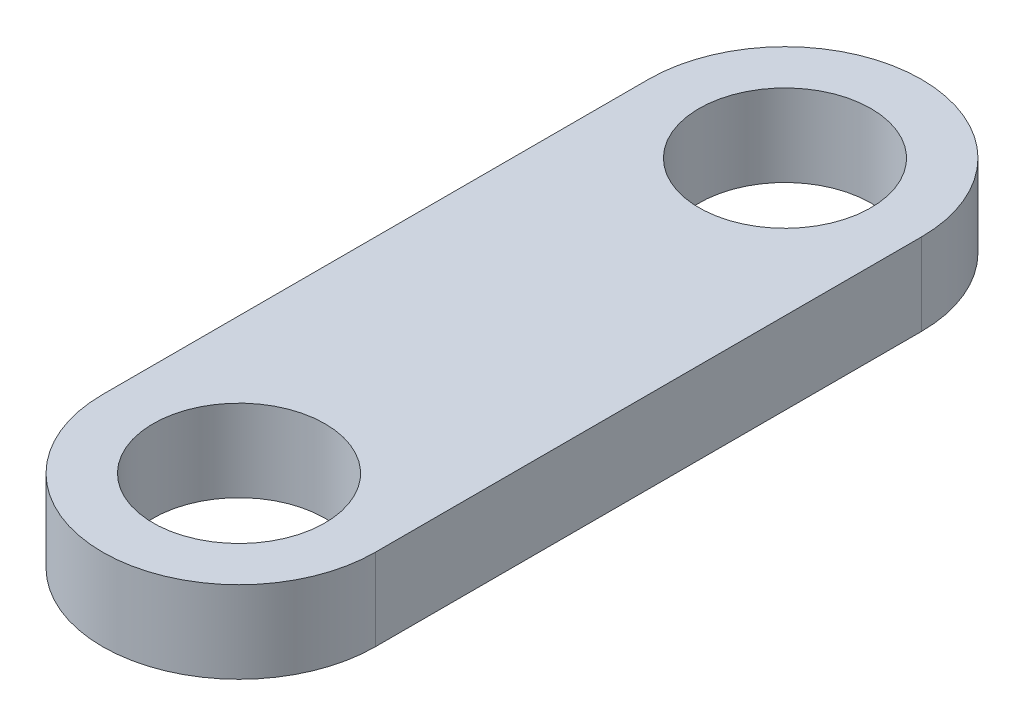
ISO-10303-21;
HEADER;
FILE_DESCRIPTION(('STEP AP214'),'2;1');
FILE_NAME('part.step','',(''),(''),'','','');
FILE_SCHEMA(('AUTOMOTIVE_DESIGN { 1 0 10303 214 1 1 1 1 }'));
ENDSEC;
DATA;
#1=APPLICATION_CONTEXT('core data for automotive mechanical design processes');
#2=APPLICATION_PROTOCOL_DEFINITION('international standard','automotive_design',2000,#1);
#3=PRODUCT_CONTEXT('',#1,'mechanical');
#4=PRODUCT('Part','Part','',(#3));
#5=PRODUCT_RELATED_PRODUCT_CATEGORY('part','',(#4));
#6=PRODUCT_DEFINITION_FORMATION('','',#4);
#7=PRODUCT_DEFINITION_CONTEXT('part definition',#1,'design');
#8=PRODUCT_DEFINITION('design','',#6,#7);
#9=PRODUCT_DEFINITION_SHAPE('','',#8);
#10=(LENGTH_UNIT() NAMED_UNIT(*) SI_UNIT(.MILLI.,.METRE.));
#11=(NAMED_UNIT(*) PLANE_ANGLE_UNIT() SI_UNIT($,.RADIAN.));
#12=(NAMED_UNIT(*) SI_UNIT($,.STERADIAN.) SOLID_ANGLE_UNIT());
#13=UNCERTAINTY_MEASURE_WITH_UNIT(LENGTH_MEASURE(1.E-05),#10,'distance_accuracy_value','');
#14=(GEOMETRIC_REPRESENTATION_CONTEXT(3) GLOBAL_UNCERTAINTY_ASSIGNED_CONTEXT((#13)) GLOBAL_UNIT_ASSIGNED_CONTEXT((#10,
#11,#12)) REPRESENTATION_CONTEXT('',''));
#15=CARTESIAN_POINT('',(0.,0.,0.));
#16=DIRECTION('',(0.,0.,1.));
#17=DIRECTION('',(1.,0.,0.));
#18=AXIS2_PLACEMENT_3D('',#15,#16,#17);
#19=CARTESIAN_POINT('',(0.,1.905,0.));
#20=DIRECTION('',(0.,-1.,0.));
#21=DIRECTION('',(0.,0.,-1.));
#22=AXIS2_PLACEMENT_3D('',#19,#20,#21);
#23=PLANE('',#22);
#24=CARTESIAN_POINT('',(0.,1.905,0.));
#25=DIRECTION('',(0.,1.,0.));
#26=DIRECTION('',(0.,0.,-1.));
#27=AXIS2_PLACEMENT_3D('',#24,#25,#26);
#28=CIRCLE('',#27,3.175);
#29=CARTESIAN_POINT('',(3.175,1.905,0.));
#30=VERTEX_POINT('',#29);
#31=CARTESIAN_POINT('',(-3.175,1.905,0.));
#32=VERTEX_POINT('',#31);
#33=EDGE_CURVE('E92',#30,#32,#28,.T.);
#34=ORIENTED_EDGE('',*,*,#33,.T.);
#35=DIRECTION('',(0.,0.,1.));
#36=VECTOR('',#35,1.);
#37=CARTESIAN_POINT('',(-3.175,1.905,0.));
#38=LINE('',#37,#36);
#39=CARTESIAN_POINT('',(-3.175,1.905,12.7));
#40=VERTEX_POINT('',#39);
#41=EDGE_CURVE('E87',#32,#40,#38,.T.);
#42=ORIENTED_EDGE('',*,*,#41,.T.);
#43=CARTESIAN_POINT('',(0.,1.905,12.7));
#44=DIRECTION('',(0.,1.,0.));
#45=DIRECTION('',(0.,0.,-1.));
#46=AXIS2_PLACEMENT_3D('',#43,#44,#45);
#47=CIRCLE('',#46,3.175);
#48=CARTESIAN_POINT('',(3.175,1.905,12.7));
#49=VERTEX_POINT('',#48);
#50=EDGE_CURVE('E90',#40,#49,#47,.T.);
#51=ORIENTED_EDGE('',*,*,#50,.T.);
#52=DIRECTION('',(0.,0.,-1.));
#53=VECTOR('',#52,1.);
#54=CARTESIAN_POINT('',(3.175,1.905,0.));
#55=LINE('',#54,#53);
#56=EDGE_CURVE('E57',#49,#30,#55,.T.);
#57=ORIENTED_EDGE('',*,*,#56,.T.);
#58=EDGE_LOOP('',(#34,#42,#51,#57));
#59=FACE_BOUND('',#58,.T.);
#60=CARTESIAN_POINT('',(0.,1.905,0.));
#61=DIRECTION('',(0.,1.,0.));
#62=DIRECTION('',(0.,0.,1.));
#63=AXIS2_PLACEMENT_3D('',#60,#61,#62);
#64=CIRCLE('',#63,2.);
#65=CARTESIAN_POINT('',(0.,1.905,-2.));
#66=VERTEX_POINT('',#65);
#67=EDGE_CURVE('E112',#66,#66,#64,.T.);
#68=ORIENTED_EDGE('',*,*,#67,.F.);
#69=EDGE_LOOP('',(#68));
#70=FACE_BOUND('',#69,.T.);
#71=CARTESIAN_POINT('',(0.,1.905,12.7));
#72=DIRECTION('',(0.,1.,0.));
#73=DIRECTION('',(0.,0.,1.));
#74=AXIS2_PLACEMENT_3D('',#71,#72,#73);
#75=CIRCLE('',#74,2.);
#76=CARTESIAN_POINT('',(0.,1.905,10.7));
#77=VERTEX_POINT('',#76);
#78=EDGE_CURVE('E134',#77,#77,#75,.T.);
#79=ORIENTED_EDGE('',*,*,#78,.F.);
#80=EDGE_LOOP('',(#79));
#81=FACE_BOUND('',#80,.T.);
#82=ADVANCED_FACE('F39',(#59,#70,#81),#23,.F.);
#83=CARTESIAN_POINT('',(0.,0.,0.));
#84=DIRECTION('',(0.,-1.,0.));
#85=DIRECTION('',(0.,0.,-1.));
#86=AXIS2_PLACEMENT_3D('',#83,#84,#85);
#87=PLANE('',#86);
#88=CARTESIAN_POINT('',(0.,0.,0.));
#89=DIRECTION('',(0.,1.,0.));
#90=DIRECTION('',(0.,0.,1.));
#91=AXIS2_PLACEMENT_3D('',#88,#89,#90);
#92=CIRCLE('',#91,2.);
#93=CARTESIAN_POINT('',(0.,0.,-2.));
#94=VERTEX_POINT('',#93);
#95=EDGE_CURVE('E130',#94,#94,#92,.T.);
#96=ORIENTED_EDGE('',*,*,#95,.T.);
#97=EDGE_LOOP('',(#96));
#98=FACE_BOUND('',#97,.T.);
#99=CARTESIAN_POINT('',(0.,0.,0.));
#100=DIRECTION('',(0.,1.,0.));
#101=DIRECTION('',(0.,0.,-1.));
#102=AXIS2_PLACEMENT_3D('',#99,#100,#101);
#103=CIRCLE('',#102,3.175);
#104=CARTESIAN_POINT('',(3.175,0.,0.));
#105=VERTEX_POINT('',#104);
#106=CARTESIAN_POINT('',(-3.175,0.,0.));
#107=VERTEX_POINT('',#106);
#108=EDGE_CURVE('E108',#105,#107,#103,.T.);
#109=ORIENTED_EDGE('',*,*,#108,.F.);
#110=DIRECTION('',(0.,0.,-1.));
#111=VECTOR('',#110,1.);
#112=CARTESIAN_POINT('',(3.175,0.,0.));
#113=LINE('',#112,#111);
#114=CARTESIAN_POINT('',(3.175,0.,12.7));
#115=VERTEX_POINT('',#114);
#116=EDGE_CURVE('E80',#115,#105,#113,.T.);
#117=ORIENTED_EDGE('',*,*,#116,.F.);
#118=CARTESIAN_POINT('',(0.,0.,12.7));
#119=DIRECTION('',(0.,1.,0.));
#120=DIRECTION('',(0.,0.,-1.));
#121=AXIS2_PLACEMENT_3D('',#118,#119,#120);
#122=CIRCLE('',#121,3.175);
#123=CARTESIAN_POINT('',(-3.175,0.,12.7));
#124=VERTEX_POINT('',#123);
#125=EDGE_CURVE('E74',#124,#115,#122,.T.);
#126=ORIENTED_EDGE('',*,*,#125,.F.);
#127=DIRECTION('',(0.,0.,1.));
#128=VECTOR('',#127,1.);
#129=CARTESIAN_POINT('',(-3.175,0.,0.));
#130=LINE('',#129,#128);
#131=EDGE_CURVE('E97',#107,#124,#130,.T.);
#132=ORIENTED_EDGE('',*,*,#131,.F.);
#133=EDGE_LOOP('',(#109,#117,#126,#132));
#134=FACE_BOUND('',#133,.T.);
#135=CARTESIAN_POINT('',(0.,0.,12.7));
#136=DIRECTION('',(0.,1.,0.));
#137=DIRECTION('',(0.,0.,1.));
#138=AXIS2_PLACEMENT_3D('',#135,#136,#137);
#139=CIRCLE('',#138,2.);
#140=CARTESIAN_POINT('',(0.,0.,10.7));
#141=VERTEX_POINT('',#140);
#142=EDGE_CURVE('E138',#141,#141,#139,.T.);
#143=ORIENTED_EDGE('',*,*,#142,.T.);
#144=EDGE_LOOP('',(#143));
#145=FACE_BOUND('',#144,.T.);
#146=ADVANCED_FACE('F125',(#98,#134,#145),#87,.T.);
#147=CARTESIAN_POINT('',(0.,1.905,0.));
#148=DIRECTION('',(0.,-1.,0.));
#149=DIRECTION('',(0.,0.,-1.));
#150=AXIS2_PLACEMENT_3D('',#147,#148,#149);
#151=CYLINDRICAL_SURFACE('',#150,3.175);
#152=ORIENTED_EDGE('',*,*,#108,.T.);
#153=DIRECTION('',(0.,-1.,0.));
#154=VECTOR('',#153,1.);
#155=CARTESIAN_POINT('',(-3.175,1.905,0.));
#156=LINE('',#155,#154);
#157=EDGE_CURVE('E11',#32,#107,#156,.T.);
#158=ORIENTED_EDGE('',*,*,#157,.F.);
#159=ORIENTED_EDGE('',*,*,#33,.F.);
#160=DIRECTION('',(0.,-1.,0.));
#161=VECTOR('',#160,1.);
#162=CARTESIAN_POINT('',(3.175,1.905,0.));
#163=LINE('',#162,#161);
#164=EDGE_CURVE('E104',#30,#105,#163,.T.);
#165=ORIENTED_EDGE('',*,*,#164,.T.);
#166=EDGE_LOOP('',(#152,#158,#159,#165));
#167=FACE_BOUND('',#166,.T.);
#168=ADVANCED_FACE('F41',(#167),#151,.T.);
#169=CARTESIAN_POINT('',(-3.175,1.905,0.));
#170=DIRECTION('',(1.,0.,0.));
#171=DIRECTION('',(0.,0.,-1.));
#172=AXIS2_PLACEMENT_3D('',#169,#170,#171);
#173=PLANE('',#172);
#174=ORIENTED_EDGE('',*,*,#131,.T.);
#175=DIRECTION('',(0.,-1.,0.));
#176=VECTOR('',#175,1.);
#177=CARTESIAN_POINT('',(-3.175,1.905,12.7));
#178=LINE('',#177,#176);
#179=EDGE_CURVE('E49',#40,#124,#178,.T.);
#180=ORIENTED_EDGE('',*,*,#179,.F.);
#181=ORIENTED_EDGE('',*,*,#41,.F.);
#182=ORIENTED_EDGE('',*,*,#157,.T.);
#183=EDGE_LOOP('',(#174,#180,#181,#182));
#184=FACE_BOUND('',#183,.T.);
#185=ADVANCED_FACE('F96',(#184),#173,.F.);
#186=CARTESIAN_POINT('',(0.,1.905,12.7));
#187=DIRECTION('',(0.,-1.,0.));
#188=DIRECTION('',(0.,0.,-1.));
#189=AXIS2_PLACEMENT_3D('',#186,#187,#188);
#190=CYLINDRICAL_SURFACE('',#189,3.175);
#191=ORIENTED_EDGE('',*,*,#125,.T.);
#192=DIRECTION('',(0.,-1.,0.));
#193=VECTOR('',#192,1.);
#194=CARTESIAN_POINT('',(3.175,1.905,12.7));
#195=LINE('',#194,#193);
#196=EDGE_CURVE('E99',#49,#115,#195,.T.);
#197=ORIENTED_EDGE('',*,*,#196,.F.);
#198=ORIENTED_EDGE('',*,*,#50,.F.);
#199=ORIENTED_EDGE('',*,*,#179,.T.);
#200=EDGE_LOOP('',(#191,#197,#198,#199));
#201=FACE_BOUND('',#200,.T.);
#202=ADVANCED_FACE('F100',(#201),#190,.T.);
#203=CARTESIAN_POINT('',(3.175,1.905,0.));
#204=DIRECTION('',(-1.,0.,0.));
#205=DIRECTION('',(0.,0.,1.));
#206=AXIS2_PLACEMENT_3D('',#203,#204,#205);
#207=PLANE('',#206);
#208=ORIENTED_EDGE('',*,*,#116,.T.);
#209=ORIENTED_EDGE('',*,*,#164,.F.);
#210=ORIENTED_EDGE('',*,*,#56,.F.);
#211=ORIENTED_EDGE('',*,*,#196,.T.);
#212=EDGE_LOOP('',(#208,#209,#210,#211));
#213=FACE_BOUND('',#212,.T.);
#214=ADVANCED_FACE('F122',(#213),#207,.F.);
#215=CARTESIAN_POINT('',(0.,1.905,0.));
#216=DIRECTION('',(0.,-1.,0.));
#217=DIRECTION('',(0.,0.,-1.));
#218=AXIS2_PLACEMENT_3D('',#215,#216,#217);
#219=CYLINDRICAL_SURFACE('',#218,2.);
#220=CARTESIAN_POINT('',(0.,1.905,-2.));
#221=CARTESIAN_POINT('',(0.,1.88515625,-2.));
#222=CARTESIAN_POINT('',(0.,1.8653125,-2.));
#223=CARTESIAN_POINT('',(0.,1.825625,-2.));
#224=CARTESIAN_POINT('',(0.,1.80578125,-2.));
#225=CARTESIAN_POINT('',(0.,1.76609375,-2.));
#226=CARTESIAN_POINT('',(0.,1.74625,-2.));
#227=CARTESIAN_POINT('',(0.,1.7065625,-2.));
#228=CARTESIAN_POINT('',(0.,1.68671875,-2.));
#229=CARTESIAN_POINT('',(0.,1.64703125,-2.));
#230=CARTESIAN_POINT('',(0.,1.6271875,-2.));
#231=CARTESIAN_POINT('',(0.,1.5875,-2.));
#232=CARTESIAN_POINT('',(0.,1.56765625,-2.));
#233=CARTESIAN_POINT('',(0.,1.52796875,-2.));
#234=CARTESIAN_POINT('',(0.,1.508125,-2.));
#235=CARTESIAN_POINT('',(0.,1.4684375,-2.));
#236=CARTESIAN_POINT('',(0.,1.44859375,-2.));
#237=CARTESIAN_POINT('',(0.,1.40890625,-2.));
#238=CARTESIAN_POINT('',(0.,1.3890625,-2.));
#239=CARTESIAN_POINT('',(0.,1.349375,-2.));
#240=CARTESIAN_POINT('',(0.,1.32953125,-2.));
#241=CARTESIAN_POINT('',(0.,1.28984375,-2.));
#242=CARTESIAN_POINT('',(0.,1.27,-2.));
#243=CARTESIAN_POINT('',(0.,1.2303125,-2.));
#244=CARTESIAN_POINT('',(0.,1.21046875,-2.));
#245=CARTESIAN_POINT('',(0.,1.17078125,-2.));
#246=CARTESIAN_POINT('',(0.,1.1509375,-2.));
#247=CARTESIAN_POINT('',(0.,1.11125,-2.));
#248=CARTESIAN_POINT('',(0.,1.09140625,-2.));
#249=CARTESIAN_POINT('',(0.,1.05171875,-2.));
#250=CARTESIAN_POINT('',(0.,1.031875,-2.));
#251=CARTESIAN_POINT('',(0.,0.9921875,-2.));
#252=CARTESIAN_POINT('',(0.,0.97234375,-2.));
#253=CARTESIAN_POINT('',(0.,0.93265625,-2.));
#254=CARTESIAN_POINT('',(0.,0.9128125,-2.));
#255=CARTESIAN_POINT('',(0.,0.873125,-2.));
#256=CARTESIAN_POINT('',(0.,0.85328125,-2.));
#257=CARTESIAN_POINT('',(0.,0.81359375,-2.));
#258=CARTESIAN_POINT('',(0.,0.79375,-2.));
#259=CARTESIAN_POINT('',(0.,0.7540625,-2.));
#260=CARTESIAN_POINT('',(0.,0.73421875,-2.));
#261=CARTESIAN_POINT('',(0.,0.69453125,-2.));
#262=CARTESIAN_POINT('',(0.,0.6746875,-2.));
#263=CARTESIAN_POINT('',(0.,0.635,-2.));
#264=CARTESIAN_POINT('',(0.,0.61515625,-2.));
#265=CARTESIAN_POINT('',(0.,0.57546875,-2.));
#266=CARTESIAN_POINT('',(0.,0.555625,-2.));
#267=CARTESIAN_POINT('',(0.,0.5159375,-2.));
#268=CARTESIAN_POINT('',(0.,0.49609375,-2.));
#269=CARTESIAN_POINT('',(0.,0.45640625,-2.));
#270=CARTESIAN_POINT('',(0.,0.4365625,-2.));
#271=CARTESIAN_POINT('',(0.,0.396875,-2.));
#272=CARTESIAN_POINT('',(0.,0.37703125,-2.));
#273=CARTESIAN_POINT('',(0.,0.33734375,-2.));
#274=CARTESIAN_POINT('',(0.,0.3175,-2.));
#275=CARTESIAN_POINT('',(0.,0.2778125,-2.));
#276=CARTESIAN_POINT('',(0.,0.25796875,-2.));
#277=CARTESIAN_POINT('',(0.,0.21828125,-2.));
#278=CARTESIAN_POINT('',(0.,0.1984375,-2.));
#279=CARTESIAN_POINT('',(0.,0.15875,-2.));
#280=CARTESIAN_POINT('',(0.,0.13890625,-2.));
#281=CARTESIAN_POINT('',(0.,0.09921875,-2.));
#282=CARTESIAN_POINT('',(0.,0.0793749999999999,-2.));
#283=CARTESIAN_POINT('',(0.,0.0396874999999999,-2.));
#284=CARTESIAN_POINT('',(0.,0.01984375,-2.));
#285=CARTESIAN_POINT('',(0.,0.,-2.));
#286=B_SPLINE_CURVE_WITH_KNOTS('',3,(#220,#221,#222,#223,#224,#225,#226,#227,#228,#229,#230,
#231,#232,#233,#234,#235,#236,#237,#238,#239,#240,#241,#242,#243,#244,#245,#246,#247,#248,#249,
#250,#251,#252,#253,#254,#255,#256,#257,#258,#259,#260,#261,#262,#263,#264,#265,#266,#267,#268,
#269,#270,#271,#272,#273,#274,#275,#276,#277,#278,#279,#280,#281,#282,#283,#284,#285),
.UNSPECIFIED.,.F.,.F.,(4,2,2,2,2,2,2,2,2,2,2,2,2,2,2,2,2,2,2,2,2,2,2,2,2,2,2,2,2,2,2,2,4),(0.,
0.0595312500000001,0.1190625,0.17859375,0.238125,0.29765625,0.3571875,0.41671875,0.47625,
0.53578125,0.5953125,0.65484375,0.714375,0.77390625,0.8334375,0.89296875,0.9525,1.01203125,
1.0715625,1.13109375,1.190625,1.25015625,1.3096875,1.36921875,1.42875,1.48828125,1.5478125,
1.60734375,1.666875,1.72640625,1.7859375,1.84546875,1.905),.UNSPECIFIED.);
#287=EDGE_CURVE('BSEAM157',#66,#94,#286,.T.);
#288=ORIENTED_EDGE('',*,*,#67,.T.);
#289=ORIENTED_EDGE('',*,*,#95,.F.);
#290=ORIENTED_EDGE('',*,*,#287,.T.);
#291=ORIENTED_EDGE('',*,*,#287,.F.);
#292=EDGE_LOOP('',(#288,#290,#289,#291));
#293=FACE_BOUND('',#292,.T.);
#294=ADVANCED_FACE('F157',(#293),#219,.F.);
#295=CARTESIAN_POINT('',(0.,1.905,12.7));
#296=DIRECTION('',(0.,-1.,0.));
#297=DIRECTION('',(0.,0.,-1.));
#298=AXIS2_PLACEMENT_3D('',#295,#296,#297);
#299=CYLINDRICAL_SURFACE('',#298,2.);
#300=CARTESIAN_POINT('',(0.,1.905,10.7));
#301=CARTESIAN_POINT('',(0.,1.88515625,10.7));
#302=CARTESIAN_POINT('',(0.,1.8653125,10.7));
#303=CARTESIAN_POINT('',(0.,1.825625,10.7));
#304=CARTESIAN_POINT('',(0.,1.80578125,10.7));
#305=CARTESIAN_POINT('',(0.,1.76609375,10.7));
#306=CARTESIAN_POINT('',(0.,1.74625,10.7));
#307=CARTESIAN_POINT('',(0.,1.7065625,10.7));
#308=CARTESIAN_POINT('',(0.,1.68671875,10.7));
#309=CARTESIAN_POINT('',(0.,1.64703125,10.7));
#310=CARTESIAN_POINT('',(0.,1.6271875,10.7));
#311=CARTESIAN_POINT('',(0.,1.5875,10.7));
#312=CARTESIAN_POINT('',(0.,1.56765625,10.7));
#313=CARTESIAN_POINT('',(0.,1.52796875,10.7));
#314=CARTESIAN_POINT('',(0.,1.508125,10.7));
#315=CARTESIAN_POINT('',(0.,1.4684375,10.7));
#316=CARTESIAN_POINT('',(0.,1.44859375,10.7));
#317=CARTESIAN_POINT('',(0.,1.40890625,10.7));
#318=CARTESIAN_POINT('',(0.,1.3890625,10.7));
#319=CARTESIAN_POINT('',(0.,1.349375,10.7));
#320=CARTESIAN_POINT('',(0.,1.32953125,10.7));
#321=CARTESIAN_POINT('',(0.,1.28984375,10.7));
#322=CARTESIAN_POINT('',(0.,1.27,10.7));
#323=CARTESIAN_POINT('',(0.,1.2303125,10.7));
#324=CARTESIAN_POINT('',(0.,1.21046875,10.7));
#325=CARTESIAN_POINT('',(0.,1.17078125,10.7));
#326=CARTESIAN_POINT('',(0.,1.1509375,10.7));
#327=CARTESIAN_POINT('',(0.,1.11125,10.7));
#328=CARTESIAN_POINT('',(0.,1.09140625,10.7));
#329=CARTESIAN_POINT('',(0.,1.05171875,10.7));
#330=CARTESIAN_POINT('',(0.,1.031875,10.7));
#331=CARTESIAN_POINT('',(0.,0.9921875,10.7));
#332=CARTESIAN_POINT('',(0.,0.97234375,10.7));
#333=CARTESIAN_POINT('',(0.,0.93265625,10.7));
#334=CARTESIAN_POINT('',(0.,0.9128125,10.7));
#335=CARTESIAN_POINT('',(0.,0.873125,10.7));
#336=CARTESIAN_POINT('',(0.,0.85328125,10.7));
#337=CARTESIAN_POINT('',(0.,0.81359375,10.7));
#338=CARTESIAN_POINT('',(0.,0.79375,10.7));
#339=CARTESIAN_POINT('',(0.,0.7540625,10.7));
#340=CARTESIAN_POINT('',(0.,0.73421875,10.7));
#341=CARTESIAN_POINT('',(0.,0.69453125,10.7));
#342=CARTESIAN_POINT('',(0.,0.6746875,10.7));
#343=CARTESIAN_POINT('',(0.,0.635,10.7));
#344=CARTESIAN_POINT('',(0.,0.61515625,10.7));
#345=CARTESIAN_POINT('',(0.,0.57546875,10.7));
#346=CARTESIAN_POINT('',(0.,0.555625,10.7));
#347=CARTESIAN_POINT('',(0.,0.5159375,10.7));
#348=CARTESIAN_POINT('',(0.,0.49609375,10.7));
#349=CARTESIAN_POINT('',(0.,0.45640625,10.7));
#350=CARTESIAN_POINT('',(0.,0.4365625,10.7));
#351=CARTESIAN_POINT('',(0.,0.396875,10.7));
#352=CARTESIAN_POINT('',(0.,0.37703125,10.7));
#353=CARTESIAN_POINT('',(0.,0.33734375,10.7));
#354=CARTESIAN_POINT('',(0.,0.3175,10.7));
#355=CARTESIAN_POINT('',(0.,0.2778125,10.7));
#356=CARTESIAN_POINT('',(0.,0.25796875,10.7));
#357=CARTESIAN_POINT('',(0.,0.21828125,10.7));
#358=CARTESIAN_POINT('',(0.,0.1984375,10.7));
#359=CARTESIAN_POINT('',(0.,0.15875,10.7));
#360=CARTESIAN_POINT('',(0.,0.13890625,10.7));
#361=CARTESIAN_POINT('',(0.,0.09921875,10.7));
#362=CARTESIAN_POINT('',(0.,0.0793749999999999,10.7));
#363=CARTESIAN_POINT('',(0.,0.0396874999999999,10.7));
#364=CARTESIAN_POINT('',(0.,0.01984375,10.7));
#365=CARTESIAN_POINT('',(0.,0.,10.7));
#366=B_SPLINE_CURVE_WITH_KNOTS('',3,(#300,#301,#302,#303,#304,#305,#306,#307,#308,#309,#310,
#311,#312,#313,#314,#315,#316,#317,#318,#319,#320,#321,#322,#323,#324,#325,#326,#327,#328,#329,
#330,#331,#332,#333,#334,#335,#336,#337,#338,#339,#340,#341,#342,#343,#344,#345,#346,#347,#348,
#349,#350,#351,#352,#353,#354,#355,#356,#357,#358,#359,#360,#361,#362,#363,#364,#365),
.UNSPECIFIED.,.F.,.F.,(4,2,2,2,2,2,2,2,2,2,2,2,2,2,2,2,2,2,2,2,2,2,2,2,2,2,2,2,2,2,2,2,4),(0.,
0.0595312500000001,0.1190625,0.17859375,0.238125,0.29765625,0.3571875,0.41671875,0.47625,
0.53578125,0.5953125,0.65484375,0.714375,0.77390625,0.8334375,0.89296875,0.9525,1.01203125,
1.0715625,1.13109375,1.190625,1.25015625,1.3096875,1.36921875,1.42875,1.48828125,1.5478125,
1.60734375,1.666875,1.72640625,1.7859375,1.84546875,1.905),.UNSPECIFIED.);
#367=EDGE_CURVE('BSEAM146',#77,#141,#366,.T.);
#368=ORIENTED_EDGE('',*,*,#78,.T.);
#369=ORIENTED_EDGE('',*,*,#142,.F.);
#370=ORIENTED_EDGE('',*,*,#367,.T.);
#371=ORIENTED_EDGE('',*,*,#367,.F.);
#372=EDGE_LOOP('',(#368,#370,#369,#371));
#373=FACE_BOUND('',#372,.T.);
#374=ADVANCED_FACE('F146',(#373),#299,.F.);
#375=CLOSED_SHELL('',(#82,#146,#168,#185,#202,#214,#294,#374));
#376=MANIFOLD_SOLID_BREP('B2',#375);
#377=ADVANCED_BREP_SHAPE_REPRESENTATION('',(#18,#376),#14);
#378=SHAPE_DEFINITION_REPRESENTATION(#9,#377);
ENDSEC;
END-ISO-10303-21;
